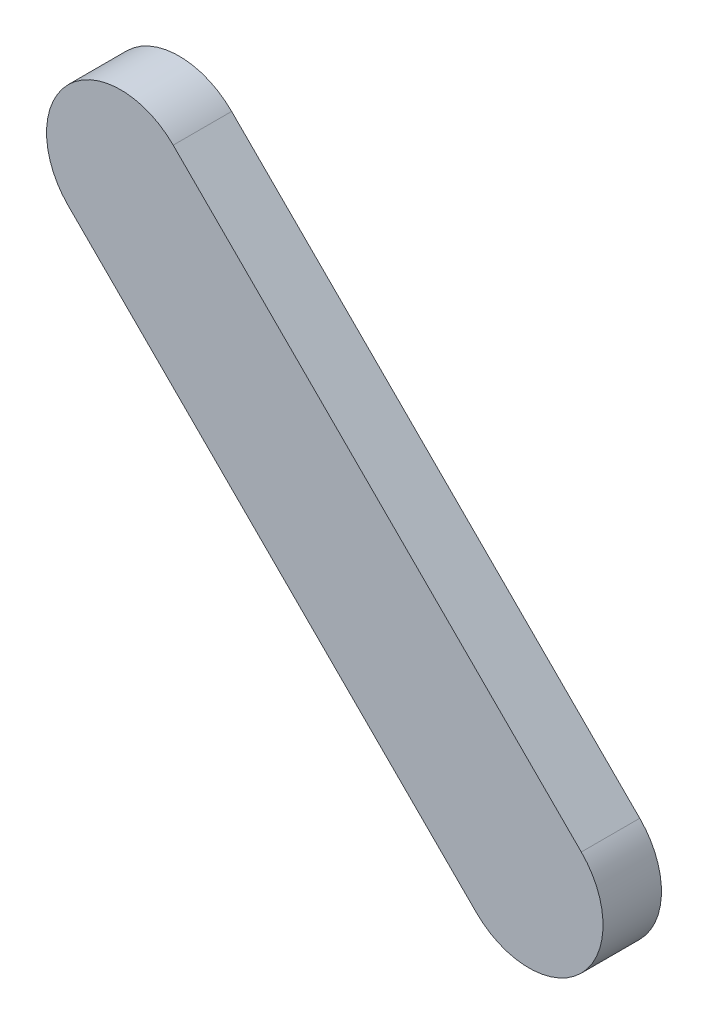
ISO-10303-21;
HEADER;
FILE_DESCRIPTION(('STEP AP214'),'2;1');
FILE_NAME('part.step','',(''),(''),'','','');
FILE_SCHEMA(('AUTOMOTIVE_DESIGN { 1 0 10303 214 1 1 1 1 }'));
ENDSEC;
DATA;
#1=APPLICATION_CONTEXT('core data for automotive mechanical design processes');
#2=APPLICATION_PROTOCOL_DEFINITION('international standard','automotive_design',2000,#1);
#3=PRODUCT_CONTEXT('',#1,'mechanical');
#4=PRODUCT('Part','Part','',(#3));
#5=PRODUCT_RELATED_PRODUCT_CATEGORY('part','',(#4));
#6=PRODUCT_DEFINITION_FORMATION('','',#4);
#7=PRODUCT_DEFINITION_CONTEXT('part definition',#1,'design');
#8=PRODUCT_DEFINITION('design','',#6,#7);
#9=PRODUCT_DEFINITION_SHAPE('','',#8);
#10=(LENGTH_UNIT() NAMED_UNIT(*) SI_UNIT(.MILLI.,.METRE.));
#11=(NAMED_UNIT(*) PLANE_ANGLE_UNIT() SI_UNIT($,.RADIAN.));
#12=(NAMED_UNIT(*) SI_UNIT($,.STERADIAN.) SOLID_ANGLE_UNIT());
#13=UNCERTAINTY_MEASURE_WITH_UNIT(LENGTH_MEASURE(1.E-05),#10,'distance_accuracy_value','');
#14=(GEOMETRIC_REPRESENTATION_CONTEXT(3) GLOBAL_UNCERTAINTY_ASSIGNED_CONTEXT((#13)) GLOBAL_UNIT_ASSIGNED_CONTEXT((#10,
#11,#12)) REPRESENTATION_CONTEXT('',''));
#15=CARTESIAN_POINT('',(0.,0.,0.));
#16=DIRECTION('',(0.,0.,1.));
#17=DIRECTION('',(1.,0.,0.));
#18=AXIS2_PLACEMENT_3D('',#15,#16,#17);
#19=CARTESIAN_POINT('',(91.76839406,53.7953966,0.));
#20=DIRECTION('',(0.707106781186549,0.707106781186546,0.));
#21=DIRECTION('',(0.707106781186546,-0.707106781186549,0.));
#22=AXIS2_PLACEMENT_3D('',#19,#20,#21);
#23=PLANE('',#22);
#24=DIRECTION('',(0.707106781186546,-0.707106781186549,0.));
#25=VECTOR('',#24,1.);
#26=CARTESIAN_POINT('',(91.76839406,53.7953966,0.1999996));
#27=LINE('',#26,#25);
#28=CARTESIAN_POINT('',(91.76839406,53.7953966,0.1999996));
#29=VERTEX_POINT('',#28);
#30=CARTESIAN_POINT('',(93.16539914,52.39839152,0.1999996));
#31=VERTEX_POINT('',#30);
#32=EDGE_CURVE('E11',#29,#31,#27,.T.);
#33=ORIENTED_EDGE('',*,*,#32,.F.);
#34=DIRECTION('',(0.,0.,1.));
#35=VECTOR('',#34,1.);
#36=CARTESIAN_POINT('',(91.76839406,53.7953966,0.));
#37=LINE('',#36,#35);
#38=CARTESIAN_POINT('',(91.76839406,53.7953966,0.));
#39=VERTEX_POINT('',#38);
#40=EDGE_CURVE('E24',#39,#29,#37,.T.);
#41=ORIENTED_EDGE('',*,*,#40,.F.);
#42=DIRECTION('',(0.707106781186546,-0.707106781186549,0.));
#43=VECTOR('',#42,1.);
#44=CARTESIAN_POINT('',(91.76839406,53.7953966,0.));
#45=LINE('',#44,#43);
#46=CARTESIAN_POINT('',(93.16539914,52.39839152,0.));
#47=VERTEX_POINT('',#46);
#48=EDGE_CURVE('E75',#39,#47,#45,.T.);
#49=ORIENTED_EDGE('',*,*,#48,.T.);
#50=DIRECTION('',(0.,0.,1.));
#51=VECTOR('',#50,1.);
#52=CARTESIAN_POINT('',(93.16539914,52.39839152,0.));
#53=LINE('',#52,#51);
#54=EDGE_CURVE('E37',#47,#31,#53,.T.);
#55=ORIENTED_EDGE('',*,*,#54,.T.);
#56=EDGE_LOOP('',(#33,#41,#49,#55));
#57=FACE_BOUND('',#56,.T.);
#58=ADVANCED_FACE('F17',(#57),#23,.F.);
#59=CARTESIAN_POINT('',(93.34500508,52.57799746,0.));
#60=DIRECTION('',(0.,0.,-1.));
#61=DIRECTION('',(-0.707106781186548,-0.707106781186548,0.));
#62=AXIS2_PLACEMENT_3D('',#59,#60,#61);
#63=CYLINDRICAL_SURFACE('',#62,0.254001156230771);
#64=CARTESIAN_POINT('',(93.34500508,52.57799746,0.1999996));
#65=DIRECTION('',(0.,0.,1.));
#66=DIRECTION('',(-0.707106781186548,-0.707106781186548,0.));
#67=AXIS2_PLACEMENT_3D('',#64,#65,#66);
#68=CIRCLE('',#67,0.254001156230771);
#69=CARTESIAN_POINT('',(93.52461102,52.7576034,0.1999996));
#70=VERTEX_POINT('',#69);
#71=EDGE_CURVE('E83',#31,#70,#68,.T.);
#72=ORIENTED_EDGE('',*,*,#71,.F.);
#73=ORIENTED_EDGE('',*,*,#54,.F.);
#74=CARTESIAN_POINT('',(93.34500508,52.57799746,0.));
#75=DIRECTION('',(0.,0.,1.));
#76=DIRECTION('',(-0.707106781186548,-0.707106781186548,0.));
#77=AXIS2_PLACEMENT_3D('',#74,#75,#76);
#78=CIRCLE('',#77,0.254001156230771);
#79=CARTESIAN_POINT('',(93.52461102,52.7576034,0.));
#80=VERTEX_POINT('',#79);
#81=EDGE_CURVE('E81',#47,#80,#78,.T.);
#82=ORIENTED_EDGE('',*,*,#81,.T.);
#83=DIRECTION('',(0.,0.,1.));
#84=VECTOR('',#83,1.);
#85=CARTESIAN_POINT('',(93.52461102,52.7576034,0.));
#86=LINE('',#85,#84);
#87=EDGE_CURVE('E67',#80,#70,#86,.T.);
#88=ORIENTED_EDGE('',*,*,#87,.T.);
#89=EDGE_LOOP('',(#72,#73,#82,#88));
#90=FACE_BOUND('',#89,.T.);
#91=ADVANCED_FACE('F89',(#90),#63,.T.);
#92=CARTESIAN_POINT('',(93.52461102,52.7576034,0.));
#93=DIRECTION('',(-0.707106781186546,-0.707106781186549,0.));
#94=DIRECTION('',(-0.707106781186549,0.707106781186546,0.));
#95=AXIS2_PLACEMENT_3D('',#92,#93,#94);
#96=PLANE('',#95);
#97=DIRECTION('',(-0.707106781186549,0.707106781186546,0.));
#98=VECTOR('',#97,1.);
#99=CARTESIAN_POINT('',(93.52461102,52.7576034,0.1999996));
#100=LINE('',#99,#98);
#101=CARTESIAN_POINT('',(92.12760594,54.15460848,0.1999996));
#102=VERTEX_POINT('',#101);
#103=EDGE_CURVE('E71',#70,#102,#100,.T.);
#104=ORIENTED_EDGE('',*,*,#103,.F.);
#105=ORIENTED_EDGE('',*,*,#87,.F.);
#106=DIRECTION('',(-0.707106781186549,0.707106781186546,0.));
#107=VECTOR('',#106,1.);
#108=CARTESIAN_POINT('',(93.52461102,52.7576034,0.));
#109=LINE('',#108,#107);
#110=CARTESIAN_POINT('',(92.12760594,54.15460848,0.));
#111=VERTEX_POINT('',#110);
#112=EDGE_CURVE('E63',#80,#111,#109,.T.);
#113=ORIENTED_EDGE('',*,*,#112,.T.);
#114=DIRECTION('',(0.,0.,1.));
#115=VECTOR('',#114,1.);
#116=CARTESIAN_POINT('',(92.12760594,54.15460848,0.));
#117=LINE('',#116,#115);
#118=EDGE_CURVE('E53',#111,#102,#117,.T.);
#119=ORIENTED_EDGE('',*,*,#118,.T.);
#120=EDGE_LOOP('',(#104,#105,#113,#119));
#121=FACE_BOUND('',#120,.T.);
#122=ADVANCED_FACE('F66',(#121),#96,.F.);
#123=CARTESIAN_POINT('',(91.948,53.97500254,0.));
#124=DIRECTION('',(0.,0.,-1.));
#125=DIRECTION('',(0.707106781186562,0.707106781186534,0.));
#126=AXIS2_PLACEMENT_3D('',#123,#124,#125);
#127=CYLINDRICAL_SURFACE('',#126,0.254001156230766);
#128=CARTESIAN_POINT('',(91.948,53.97500254,0.1999996));
#129=DIRECTION('',(0.,0.,1.));
#130=DIRECTION('',(0.707106781186562,0.707106781186534,0.));
#131=AXIS2_PLACEMENT_3D('',#128,#129,#130);
#132=CIRCLE('',#131,0.254001156230766);
#133=EDGE_CURVE('E59',#102,#29,#132,.T.);
#134=ORIENTED_EDGE('',*,*,#133,.F.);
#135=ORIENTED_EDGE('',*,*,#118,.F.);
#136=CARTESIAN_POINT('',(91.948,53.97500254,0.));
#137=DIRECTION('',(0.,0.,1.));
#138=DIRECTION('',(0.707106781186562,0.707106781186534,0.));
#139=AXIS2_PLACEMENT_3D('',#136,#137,#138);
#140=CIRCLE('',#139,0.254001156230766);
#141=EDGE_CURVE('E57',#111,#39,#140,.T.);
#142=ORIENTED_EDGE('',*,*,#141,.T.);
#143=ORIENTED_EDGE('',*,*,#40,.T.);
#144=EDGE_LOOP('',(#134,#135,#142,#143));
#145=FACE_BOUND('',#144,.T.);
#146=ADVANCED_FACE('F55',(#145),#127,.T.);
#147=CARTESIAN_POINT('',(91.76839406,53.7953966,0.));
#148=DIRECTION('',(0.,0.,-1.));
#149=DIRECTION('',(-1.,0.,0.));
#150=AXIS2_PLACEMENT_3D('',#147,#148,#149);
#151=PLANE('',#150);
#152=ORIENTED_EDGE('',*,*,#141,.F.);
#153=ORIENTED_EDGE('',*,*,#112,.F.);
#154=ORIENTED_EDGE('',*,*,#81,.F.);
#155=ORIENTED_EDGE('',*,*,#48,.F.);
#156=EDGE_LOOP('',(#152,#153,#154,#155));
#157=FACE_BOUND('',#156,.T.);
#158=ADVANCED_FACE('F74',(#157),#151,.T.);
#159=CARTESIAN_POINT('',(91.76839406,53.7953966,0.1999996));
#160=DIRECTION('',(0.,0.,-1.));
#161=DIRECTION('',(-1.,0.,0.));
#162=AXIS2_PLACEMENT_3D('',#159,#160,#161);
#163=PLANE('',#162);
#164=ORIENTED_EDGE('',*,*,#32,.T.);
#165=ORIENTED_EDGE('',*,*,#71,.T.);
#166=ORIENTED_EDGE('',*,*,#103,.T.);
#167=ORIENTED_EDGE('',*,*,#133,.T.);
#168=EDGE_LOOP('',(#164,#165,#166,#167));
#169=FACE_BOUND('',#168,.T.);
#170=ADVANCED_FACE('F91',(#169),#163,.F.);
#171=CLOSED_SHELL('',(#58,#91,#122,#146,#158,#170));
#172=MANIFOLD_SOLID_BREP('B1',#171);
#173=ADVANCED_BREP_SHAPE_REPRESENTATION('',(#18,#172),#14);
#174=SHAPE_DEFINITION_REPRESENTATION(#9,#173);
ENDSEC;
END-ISO-10303-21;
